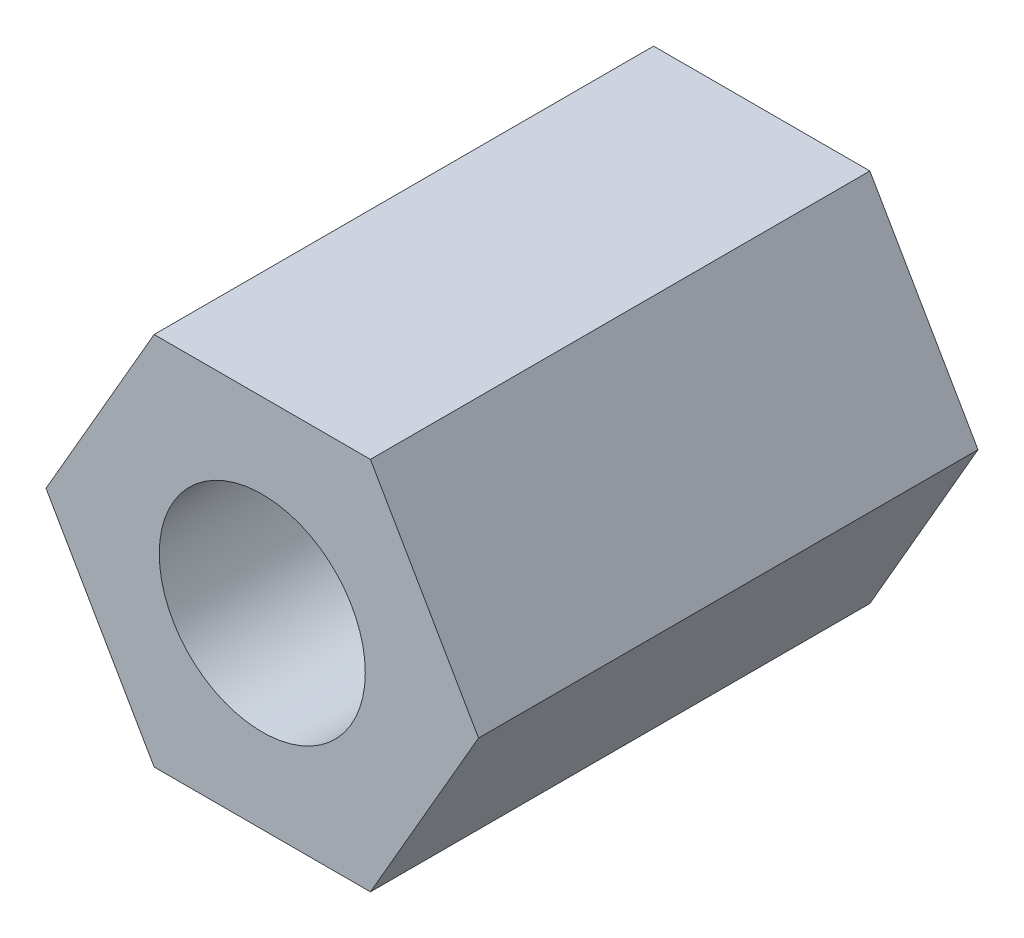
ISO-10303-21;
HEADER;
FILE_DESCRIPTION(('STEP AP214'),'2;1');
FILE_NAME('part.step','',(''),(''),'','','');
FILE_SCHEMA(('AUTOMOTIVE_DESIGN { 1 0 10303 214 1 1 1 1 }'));
ENDSEC;
DATA;
#1=APPLICATION_CONTEXT('core data for automotive mechanical design processes');
#2=APPLICATION_PROTOCOL_DEFINITION('international standard','automotive_design',2000,#1);
#3=PRODUCT_CONTEXT('',#1,'mechanical');
#4=PRODUCT('Part','Part','',(#3));
#5=PRODUCT_RELATED_PRODUCT_CATEGORY('part','',(#4));
#6=PRODUCT_DEFINITION_FORMATION('','',#4);
#7=PRODUCT_DEFINITION_CONTEXT('part definition',#1,'design');
#8=PRODUCT_DEFINITION('design','',#6,#7);
#9=PRODUCT_DEFINITION_SHAPE('','',#8);
#10=(LENGTH_UNIT() NAMED_UNIT(*) SI_UNIT(.MILLI.,.METRE.));
#11=(NAMED_UNIT(*) PLANE_ANGLE_UNIT() SI_UNIT($,.RADIAN.));
#12=(NAMED_UNIT(*) SI_UNIT($,.STERADIAN.) SOLID_ANGLE_UNIT());
#13=UNCERTAINTY_MEASURE_WITH_UNIT(LENGTH_MEASURE(1.E-05),#10,'distance_accuracy_value','');
#14=(GEOMETRIC_REPRESENTATION_CONTEXT(3) GLOBAL_UNCERTAINTY_ASSIGNED_CONTEXT((#13)) GLOBAL_UNIT_ASSIGNED_CONTEXT((#10,
#11,#12)) REPRESENTATION_CONTEXT('',''));
#15=CARTESIAN_POINT('',(0.,0.,0.));
#16=DIRECTION('',(0.,0.,1.));
#17=DIRECTION('',(1.,0.,0.));
#18=AXIS2_PLACEMENT_3D('',#15,#16,#17);
#19=CARTESIAN_POINT('',(1.7320508075689,-2.99999999999996,8.));
#20=DIRECTION('',(-0.866025403784441,0.499999999999995,0.));
#21=DIRECTION('',(-0.499999999999995,-0.866025403784442,0.));
#22=AXIS2_PLACEMENT_3D('',#19,#20,#21);
#23=PLANE('',#22);
#24=DIRECTION('',(0.499999999999995,0.866025403784442,0.));
#25=VECTOR('',#24,1.);
#26=CARTESIAN_POINT('',(1.7320508075689,-2.99999999999996,0.));
#27=LINE('',#26,#25);
#28=CARTESIAN_POINT('',(1.7320508075689,-2.99999999999996,0.));
#29=VERTEX_POINT('',#28);
#30=CARTESIAN_POINT('',(3.46410161513774,0.,0.));
#31=VERTEX_POINT('',#30);
#32=EDGE_CURVE('E140',#29,#31,#27,.T.);
#33=ORIENTED_EDGE('',*,*,#32,.T.);
#34=DIRECTION('',(0.,0.,-1.));
#35=VECTOR('',#34,1.);
#36=CARTESIAN_POINT('',(3.46410161513774,0.,8.));
#37=LINE('',#36,#35);
#38=CARTESIAN_POINT('',(3.46410161513774,0.,8.));
#39=VERTEX_POINT('',#38);
#40=EDGE_CURVE('E11',#39,#31,#37,.T.);
#41=ORIENTED_EDGE('',*,*,#40,.F.);
#42=DIRECTION('',(0.499999999999995,0.866025403784442,0.));
#43=VECTOR('',#42,1.);
#44=CARTESIAN_POINT('',(1.7320508075689,-2.99999999999996,8.));
#45=LINE('',#44,#43);
#46=CARTESIAN_POINT('',(1.7320508075689,-2.99999999999996,8.));
#47=VERTEX_POINT('',#46);
#48=EDGE_CURVE('E157',#47,#39,#45,.T.);
#49=ORIENTED_EDGE('',*,*,#48,.F.);
#50=DIRECTION('',(0.,0.,-1.));
#51=VECTOR('',#50,1.);
#52=CARTESIAN_POINT('',(1.7320508075689,-2.99999999999996,8.));
#53=LINE('',#52,#51);
#54=EDGE_CURVE('E136',#47,#29,#53,.T.);
#55=ORIENTED_EDGE('',*,*,#54,.T.);
#56=EDGE_LOOP('',(#33,#41,#49,#55));
#57=FACE_BOUND('',#56,.T.);
#58=ADVANCED_FACE('F51',(#57),#23,.F.);
#59=CARTESIAN_POINT('',(3.46410161513774,0.,8.));
#60=DIRECTION('',(-0.866025403784438,-0.500000000000001,0.));
#61=DIRECTION('',(0.500000000000001,-0.866025403784438,0.));
#62=AXIS2_PLACEMENT_3D('',#59,#60,#61);
#63=PLANE('',#62);
#64=DIRECTION('',(-0.500000000000001,0.866025403784438,0.));
#65=VECTOR('',#64,1.);
#66=CARTESIAN_POINT('',(3.46410161513774,0.,0.));
#67=LINE('',#66,#65);
#68=CARTESIAN_POINT('',(1.73205080756886,2.99999999999999,0.));
#69=VERTEX_POINT('',#68);
#70=EDGE_CURVE('E144',#31,#69,#67,.T.);
#71=ORIENTED_EDGE('',*,*,#70,.T.);
#72=DIRECTION('',(0.,0.,-1.));
#73=VECTOR('',#72,1.);
#74=CARTESIAN_POINT('',(1.73205080756886,2.99999999999999,8.));
#75=LINE('',#74,#73);
#76=CARTESIAN_POINT('',(1.73205080756886,2.99999999999999,8.));
#77=VERTEX_POINT('',#76);
#78=EDGE_CURVE('E60',#77,#69,#75,.T.);
#79=ORIENTED_EDGE('',*,*,#78,.F.);
#80=DIRECTION('',(-0.500000000000001,0.866025403784438,0.));
#81=VECTOR('',#80,1.);
#82=CARTESIAN_POINT('',(3.46410161513774,0.,8.));
#83=LINE('',#82,#81);
#84=EDGE_CURVE('E105',#39,#77,#83,.T.);
#85=ORIENTED_EDGE('',*,*,#84,.F.);
#86=ORIENTED_EDGE('',*,*,#40,.T.);
#87=EDGE_LOOP('',(#71,#79,#85,#86));
#88=FACE_BOUND('',#87,.T.);
#89=ADVANCED_FACE('F186',(#88),#63,.F.);
#90=CARTESIAN_POINT('',(1.73205080756886,2.99999999999999,8.));
#91=DIRECTION('',(0.,-1.,0.));
#92=DIRECTION('',(1.,0.,0.));
#93=AXIS2_PLACEMENT_3D('',#90,#91,#92);
#94=PLANE('',#93);
#95=DIRECTION('',(-1.,0.,0.));
#96=VECTOR('',#95,1.);
#97=CARTESIAN_POINT('',(1.73205080756886,2.99999999999999,0.));
#98=LINE('',#97,#96);
#99=CARTESIAN_POINT('',(-1.73205080756888,2.99999999999998,0.));
#100=VERTEX_POINT('',#99);
#101=EDGE_CURVE('E148',#69,#100,#98,.T.);
#102=ORIENTED_EDGE('',*,*,#101,.T.);
#103=DIRECTION('',(0.,0.,-1.));
#104=VECTOR('',#103,1.);
#105=CARTESIAN_POINT('',(-1.73205080756888,2.99999999999998,8.));
#106=LINE('',#105,#104);
#107=CARTESIAN_POINT('',(-1.73205080756888,2.99999999999998,8.));
#108=VERTEX_POINT('',#107);
#109=EDGE_CURVE('E129',#108,#100,#106,.T.);
#110=ORIENTED_EDGE('',*,*,#109,.F.);
#111=DIRECTION('',(-1.,0.,0.));
#112=VECTOR('',#111,1.);
#113=CARTESIAN_POINT('',(1.73205080756886,2.99999999999999,8.));
#114=LINE('',#113,#112);
#115=EDGE_CURVE('E118',#77,#108,#114,.T.);
#116=ORIENTED_EDGE('',*,*,#115,.F.);
#117=ORIENTED_EDGE('',*,*,#78,.T.);
#118=EDGE_LOOP('',(#102,#110,#116,#117));
#119=FACE_BOUND('',#118,.T.);
#120=ADVANCED_FACE('F167',(#119),#94,.F.);
#121=CARTESIAN_POINT('',(-1.73205080756888,2.99999999999998,8.));
#122=DIRECTION('',(0.866025403784442,-0.499999999999995,0.));
#123=DIRECTION('',(0.499999999999995,0.866025403784442,0.));
#124=AXIS2_PLACEMENT_3D('',#121,#122,#123);
#125=PLANE('',#124);
#126=DIRECTION('',(-0.499999999999995,-0.866025403784442,0.));
#127=VECTOR('',#126,1.);
#128=CARTESIAN_POINT('',(-1.73205080756888,2.99999999999998,0.));
#129=LINE('',#128,#127);
#130=CARTESIAN_POINT('',(-3.46410161513774,0.,0.));
#131=VERTEX_POINT('',#130);
#132=EDGE_CURVE('E127',#100,#131,#129,.T.);
#133=ORIENTED_EDGE('',*,*,#132,.T.);
#134=DIRECTION('',(0.,0.,-1.));
#135=VECTOR('',#134,1.);
#136=CARTESIAN_POINT('',(-3.46410161513774,0.,8.));
#137=LINE('',#136,#135);
#138=CARTESIAN_POINT('',(-3.46410161513774,0.,8.));
#139=VERTEX_POINT('',#138);
#140=EDGE_CURVE('E124',#139,#131,#137,.T.);
#141=ORIENTED_EDGE('',*,*,#140,.F.);
#142=DIRECTION('',(-0.499999999999995,-0.866025403784442,0.));
#143=VECTOR('',#142,1.);
#144=CARTESIAN_POINT('',(-1.73205080756888,2.99999999999998,8.));
#145=LINE('',#144,#143);
#146=EDGE_CURVE('E112',#108,#139,#145,.T.);
#147=ORIENTED_EDGE('',*,*,#146,.F.);
#148=ORIENTED_EDGE('',*,*,#109,.T.);
#149=EDGE_LOOP('',(#133,#141,#147,#148));
#150=FACE_BOUND('',#149,.T.);
#151=ADVANCED_FACE('F125',(#150),#125,.F.);
#152=CARTESIAN_POINT('',(-3.46410161513774,0.,8.));
#153=DIRECTION('',(0.866025403784435,0.500000000000007,0.));
#154=DIRECTION('',(-0.500000000000007,0.866025403784435,0.));
#155=AXIS2_PLACEMENT_3D('',#152,#153,#154);
#156=PLANE('',#155);
#157=DIRECTION('',(0.500000000000007,-0.866025403784435,0.));
#158=VECTOR('',#157,1.);
#159=CARTESIAN_POINT('',(-3.46410161513774,0.,0.));
#160=LINE('',#159,#158);
#161=CARTESIAN_POINT('',(-1.73205080756884,-3.,0.));
#162=VERTEX_POINT('',#161);
#163=EDGE_CURVE('E91',#131,#162,#160,.T.);
#164=ORIENTED_EDGE('',*,*,#163,.T.);
#165=DIRECTION('',(0.,0.,-1.));
#166=VECTOR('',#165,1.);
#167=CARTESIAN_POINT('',(-1.73205080756884,-3.,8.));
#168=LINE('',#167,#166);
#169=CARTESIAN_POINT('',(-1.73205080756884,-3.,8.));
#170=VERTEX_POINT('',#169);
#171=EDGE_CURVE('E130',#170,#162,#168,.T.);
#172=ORIENTED_EDGE('',*,*,#171,.F.);
#173=DIRECTION('',(0.500000000000007,-0.866025403784435,0.));
#174=VECTOR('',#173,1.);
#175=CARTESIAN_POINT('',(-3.46410161513774,0.,8.));
#176=LINE('',#175,#174);
#177=EDGE_CURVE('E116',#139,#170,#176,.T.);
#178=ORIENTED_EDGE('',*,*,#177,.F.);
#179=ORIENTED_EDGE('',*,*,#140,.T.);
#180=EDGE_LOOP('',(#164,#172,#178,#179));
#181=FACE_BOUND('',#180,.T.);
#182=ADVANCED_FACE('F132',(#181),#156,.F.);
#183=CARTESIAN_POINT('',(-1.73205080756884,-3.,8.));
#184=DIRECTION('',(0.,1.,0.));
#185=DIRECTION('',(-1.,0.,0.));
#186=AXIS2_PLACEMENT_3D('',#183,#184,#185);
#187=PLANE('',#186);
#188=DIRECTION('',(1.,0.,0.));
#189=VECTOR('',#188,1.);
#190=CARTESIAN_POINT('',(-1.73205080756884,-3.,0.));
#191=LINE('',#190,#189);
#192=EDGE_CURVE('E97',#162,#29,#191,.T.);
#193=ORIENTED_EDGE('',*,*,#192,.T.);
#194=ORIENTED_EDGE('',*,*,#54,.F.);
#195=DIRECTION('',(1.,0.,0.));
#196=VECTOR('',#195,1.);
#197=CARTESIAN_POINT('',(-1.73205080756884,-3.,8.));
#198=LINE('',#197,#196);
#199=EDGE_CURVE('E68',#170,#47,#198,.T.);
#200=ORIENTED_EDGE('',*,*,#199,.F.);
#201=ORIENTED_EDGE('',*,*,#171,.T.);
#202=EDGE_LOOP('',(#193,#194,#200,#201));
#203=FACE_BOUND('',#202,.T.);
#204=ADVANCED_FACE('F174',(#203),#187,.F.);
#205=CARTESIAN_POINT('',(0.,0.,8.));
#206=DIRECTION('',(0.,0.,1.));
#207=DIRECTION('',(1.,0.,0.));
#208=AXIS2_PLACEMENT_3D('',#205,#206,#207);
#209=PLANE('',#208);
#210=CARTESIAN_POINT('',(0.,0.,8.));
#211=DIRECTION('',(0.,0.,-1.));
#212=DIRECTION('',(-1.,0.,0.));
#213=AXIS2_PLACEMENT_3D('',#210,#211,#212);
#214=CIRCLE('',#213,1.65);
#215=CARTESIAN_POINT('',(-1.65,0.,8.));
#216=VERTEX_POINT('',#215);
#217=EDGE_CURVE('E145',#216,#216,#214,.T.);
#218=ORIENTED_EDGE('',*,*,#217,.T.);
#219=EDGE_LOOP('',(#218));
#220=FACE_BOUND('',#219,.T.);
#221=ORIENTED_EDGE('',*,*,#48,.T.);
#222=ORIENTED_EDGE('',*,*,#84,.T.);
#223=ORIENTED_EDGE('',*,*,#115,.T.);
#224=ORIENTED_EDGE('',*,*,#146,.T.);
#225=ORIENTED_EDGE('',*,*,#177,.T.);
#226=ORIENTED_EDGE('',*,*,#199,.T.);
#227=EDGE_LOOP('',(#221,#222,#223,#224,#225,#226));
#228=FACE_BOUND('',#227,.T.);
#229=ADVANCED_FACE('F114',(#220,#228),#209,.T.);
#230=CARTESIAN_POINT('',(0.,0.,0.));
#231=DIRECTION('',(0.,0.,1.));
#232=DIRECTION('',(1.,0.,0.));
#233=AXIS2_PLACEMENT_3D('',#230,#231,#232);
#234=PLANE('',#233);
#235=CARTESIAN_POINT('',(0.,0.,0.));
#236=DIRECTION('',(0.,0.,-1.));
#237=DIRECTION('',(-1.,0.,0.));
#238=AXIS2_PLACEMENT_3D('',#235,#236,#237);
#239=CIRCLE('',#238,2.025);
#240=CARTESIAN_POINT('',(-2.025,0.,0.));
#241=VERTEX_POINT('',#240);
#242=EDGE_CURVE('E255',#241,#241,#239,.T.);
#243=ORIENTED_EDGE('',*,*,#242,.F.);
#244=EDGE_LOOP('',(#243));
#245=FACE_BOUND('',#244,.T.);
#246=ORIENTED_EDGE('',*,*,#32,.F.);
#247=ORIENTED_EDGE('',*,*,#192,.F.);
#248=ORIENTED_EDGE('',*,*,#163,.F.);
#249=ORIENTED_EDGE('',*,*,#132,.F.);
#250=ORIENTED_EDGE('',*,*,#101,.F.);
#251=ORIENTED_EDGE('',*,*,#70,.F.);
#252=EDGE_LOOP('',(#246,#247,#248,#249,#250,#251));
#253=FACE_BOUND('',#252,.T.);
#254=ADVANCED_FACE('F170',(#245,#253),#234,.F.);
#255=CARTESIAN_POINT('',(0.,0.,0.));
#256=DIRECTION('',(0.,0.,-1.));
#257=DIRECTION('',(-1.,0.,0.));
#258=AXIS2_PLACEMENT_3D('',#255,#256,#257);
#259=CYLINDRICAL_SURFACE('',#258,1.65);
#260=ORIENTED_EDGE('',*,*,#217,.F.);
#261=EDGE_LOOP('',(#260));
#262=FACE_BOUND('',#261,.T.);
#263=CARTESIAN_POINT('',(0.,0.,0.375000000000002));
#264=DIRECTION('',(0.,0.,-1.));
#265=DIRECTION('',(-1.,0.,0.));
#266=AXIS2_PLACEMENT_3D('',#263,#264,#265);
#267=CIRCLE('',#266,1.65);
#268=CARTESIAN_POINT('',(-1.65,0.,0.375000000000002));
#269=VERTEX_POINT('',#268);
#270=EDGE_CURVE('E252',#269,#269,#267,.T.);
#271=ORIENTED_EDGE('',*,*,#270,.T.);
#272=EDGE_LOOP('',(#271));
#273=FACE_BOUND('',#272,.T.);
#274=ADVANCED_FACE('F225',(#262,#273),#259,.F.);
#275=CARTESIAN_POINT('',(0.,0.,0.));
#276=DIRECTION('',(0.,0.,-1.));
#277=DIRECTION('',(-1.,0.,0.));
#278=AXIS2_PLACEMENT_3D('',#275,#276,#277);
#279=CONICAL_SURFACE('',#278,2.025,0.785398163397447);
#280=ORIENTED_EDGE('',*,*,#270,.F.);
#281=EDGE_LOOP('',(#280));
#282=FACE_BOUND('',#281,.T.);
#283=ORIENTED_EDGE('',*,*,#242,.T.);
#284=EDGE_LOOP('',(#283));
#285=FACE_BOUND('',#284,.T.);
#286=ADVANCED_FACE('F235',(#282,#285),#279,.F.);
#287=CLOSED_SHELL('',(#58,#89,#120,#151,#182,#204,#229,#254,#274,#286));
#288=MANIFOLD_SOLID_BREP('B2',#287);
#289=ADVANCED_BREP_SHAPE_REPRESENTATION('',(#18,#288),#14);
#290=SHAPE_DEFINITION_REPRESENTATION(#9,#289);
ENDSEC;
END-ISO-10303-21;
